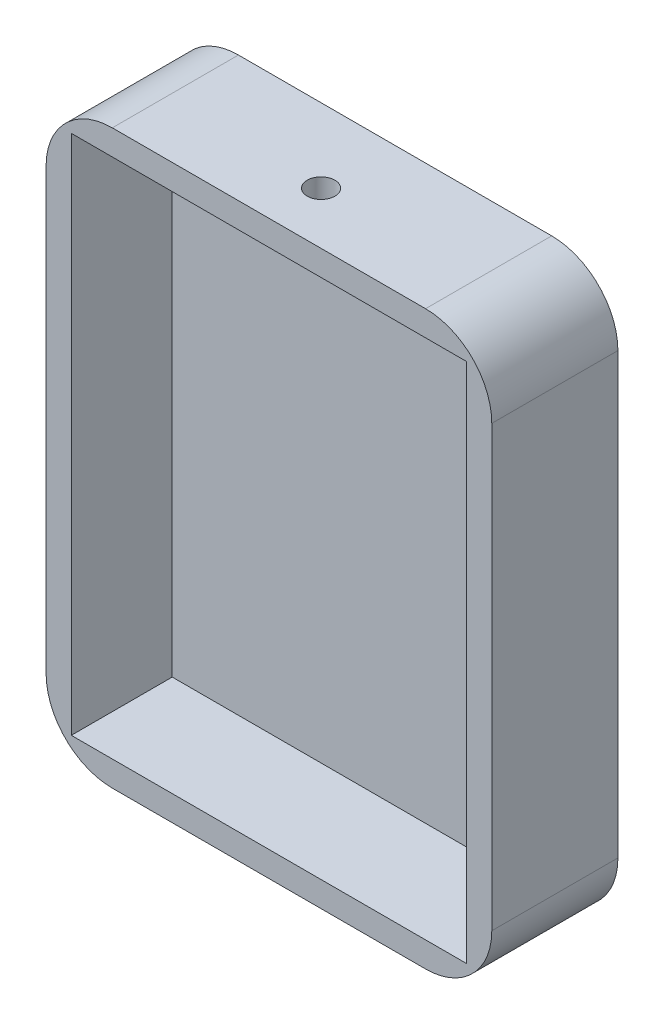
ISO-10303-21;
HEADER;
FILE_DESCRIPTION(('STEP AP214'),'2;1');
FILE_NAME('part.step','',(''),(''),'','','');
FILE_SCHEMA(('AUTOMOTIVE_DESIGN { 1 0 10303 214 1 1 1 1 }'));
ENDSEC;
DATA;
#1=APPLICATION_CONTEXT('core data for automotive mechanical design processes');
#2=APPLICATION_PROTOCOL_DEFINITION('international standard','automotive_design',2000,#1);
#3=PRODUCT_CONTEXT('',#1,'mechanical');
#4=PRODUCT('Part','Part','',(#3));
#5=PRODUCT_RELATED_PRODUCT_CATEGORY('part','',(#4));
#6=PRODUCT_DEFINITION_FORMATION('','',#4);
#7=PRODUCT_DEFINITION_CONTEXT('part definition',#1,'design');
#8=PRODUCT_DEFINITION('design','',#6,#7);
#9=PRODUCT_DEFINITION_SHAPE('','',#8);
#10=(LENGTH_UNIT() NAMED_UNIT(*) SI_UNIT(.MILLI.,.METRE.));
#11=(NAMED_UNIT(*) PLANE_ANGLE_UNIT() SI_UNIT($,.RADIAN.));
#12=(NAMED_UNIT(*) SI_UNIT($,.STERADIAN.) SOLID_ANGLE_UNIT());
#13=UNCERTAINTY_MEASURE_WITH_UNIT(LENGTH_MEASURE(1.E-05),#10,'distance_accuracy_value','');
#14=(GEOMETRIC_REPRESENTATION_CONTEXT(3) GLOBAL_UNCERTAINTY_ASSIGNED_CONTEXT((#13)) GLOBAL_UNIT_ASSIGNED_CONTEXT((#10,
#11,#12)) REPRESENTATION_CONTEXT('',''));
#15=CARTESIAN_POINT('',(0.,0.,0.));
#16=DIRECTION('',(0.,0.,1.));
#17=DIRECTION('',(1.,0.,0.));
#18=AXIS2_PLACEMENT_3D('',#15,#16,#17);
#19=CARTESIAN_POINT('',(0.,0.,19.05));
#20=DIRECTION('',(0.,0.,-1.));
#21=DIRECTION('',(-1.,0.,0.));
#22=AXIS2_PLACEMENT_3D('',#19,#20,#21);
#23=PLANE('',#22);
#24=DIRECTION('',(0.,-1.,0.));
#25=VECTOR('',#24,1.);
#26=CARTESIAN_POINT('',(-33.655,-43.18,19.05));
#27=LINE('',#26,#25);
#28=CARTESIAN_POINT('',(-33.655,33.18,19.05));
#29=VERTEX_POINT('',#28);
#30=CARTESIAN_POINT('',(-33.655,-33.18,19.05));
#31=VERTEX_POINT('',#30);
#32=EDGE_CURVE('E183',#29,#31,#27,.T.);
#33=ORIENTED_EDGE('',*,*,#32,.T.);
#34=CARTESIAN_POINT('',(-23.655,-33.18,19.05));
#35=DIRECTION('',(0.,0.,-1.));
#36=DIRECTION('',(-1.,0.,0.));
#37=AXIS2_PLACEMENT_3D('',#34,#35,#36);
#38=CIRCLE('',#37,10.);
#39=CARTESIAN_POINT('',(-23.655,-43.18,19.05));
#40=VERTEX_POINT('',#39);
#41=EDGE_CURVE('E239',#31,#40,#38,.F.);
#42=ORIENTED_EDGE('',*,*,#41,.T.);
#43=DIRECTION('',(1.,0.,0.));
#44=VECTOR('',#43,1.);
#45=CARTESIAN_POINT('',(-33.655,-43.18,19.05));
#46=LINE('',#45,#44);
#47=CARTESIAN_POINT('',(23.655,-43.18,19.05));
#48=VERTEX_POINT('',#47);
#49=EDGE_CURVE('E187',#40,#48,#46,.T.);
#50=ORIENTED_EDGE('',*,*,#49,.T.);
#51=CARTESIAN_POINT('',(23.655,-33.18,19.05));
#52=DIRECTION('',(0.,0.,-1.));
#53=DIRECTION('',(-1.,0.,0.));
#54=AXIS2_PLACEMENT_3D('',#51,#52,#53);
#55=CIRCLE('',#54,10.);
#56=CARTESIAN_POINT('',(33.655,-33.18,19.05));
#57=VERTEX_POINT('',#56);
#58=EDGE_CURVE('E233',#48,#57,#55,.F.);
#59=ORIENTED_EDGE('',*,*,#58,.T.);
#60=DIRECTION('',(0.,1.,0.));
#61=VECTOR('',#60,1.);
#62=CARTESIAN_POINT('',(33.655,-43.18,19.05));
#63=LINE('',#62,#61);
#64=CARTESIAN_POINT('',(33.655,33.18,19.05));
#65=VERTEX_POINT('',#64);
#66=EDGE_CURVE('E176',#57,#65,#63,.T.);
#67=ORIENTED_EDGE('',*,*,#66,.T.);
#68=CARTESIAN_POINT('',(23.655,33.18,19.05));
#69=DIRECTION('',(0.,0.,-1.));
#70=DIRECTION('',(-1.,0.,0.));
#71=AXIS2_PLACEMENT_3D('',#68,#69,#70);
#72=CIRCLE('',#71,10.);
#73=CARTESIAN_POINT('',(23.655,43.18,19.05));
#74=VERTEX_POINT('',#73);
#75=EDGE_CURVE('E61',#65,#74,#72,.F.);
#76=ORIENTED_EDGE('',*,*,#75,.T.);
#77=DIRECTION('',(-1.,0.,0.));
#78=VECTOR('',#77,1.);
#79=CARTESIAN_POINT('',(-33.655,43.18,19.05));
#80=LINE('',#79,#78);
#81=CARTESIAN_POINT('',(-23.655,43.18,19.05));
#82=VERTEX_POINT('',#81);
#83=EDGE_CURVE('E179',#74,#82,#80,.T.);
#84=ORIENTED_EDGE('',*,*,#83,.T.);
#85=CARTESIAN_POINT('',(-23.655,33.18,19.05));
#86=DIRECTION('',(0.,0.,-1.));
#87=DIRECTION('',(-1.,0.,0.));
#88=AXIS2_PLACEMENT_3D('',#85,#86,#87);
#89=CIRCLE('',#88,10.);
#90=EDGE_CURVE('E236',#82,#29,#89,.F.);
#91=ORIENTED_EDGE('',*,*,#90,.T.);
#92=EDGE_LOOP('',(#33,#42,#50,#59,#67,#76,#84,#91));
#93=FACE_BOUND('',#92,.T.);
#94=DIRECTION('',(0.,1.,0.));
#95=VECTOR('',#94,1.);
#96=CARTESIAN_POINT('',(29.845,0.,19.05));
#97=LINE('',#96,#95);
#98=CARTESIAN_POINT('',(29.845,-39.37,19.05));
#99=VERTEX_POINT('',#98);
#100=CARTESIAN_POINT('',(29.845,39.37,19.05));
#101=VERTEX_POINT('',#100);
#102=EDGE_CURVE('E160',#99,#101,#97,.T.);
#103=ORIENTED_EDGE('',*,*,#102,.F.);
#104=DIRECTION('',(1.,0.,0.));
#105=VECTOR('',#104,1.);
#106=CARTESIAN_POINT('',(0.,-39.37,19.05));
#107=LINE('',#106,#105);
#108=CARTESIAN_POINT('',(-29.845,-39.37,19.05));
#109=VERTEX_POINT('',#108);
#110=EDGE_CURVE('E173',#109,#99,#107,.T.);
#111=ORIENTED_EDGE('',*,*,#110,.F.);
#112=DIRECTION('',(0.,-1.,0.));
#113=VECTOR('',#112,1.);
#114=CARTESIAN_POINT('',(-29.845,0.,19.05));
#115=LINE('',#114,#113);
#116=CARTESIAN_POINT('',(-29.845,39.37,19.05));
#117=VERTEX_POINT('',#116);
#118=EDGE_CURVE('E170',#117,#109,#115,.T.);
#119=ORIENTED_EDGE('',*,*,#118,.F.);
#120=DIRECTION('',(-1.,0.,0.));
#121=VECTOR('',#120,1.);
#122=CARTESIAN_POINT('',(0.,39.37,19.05));
#123=LINE('',#122,#121);
#124=EDGE_CURVE('E146',#101,#117,#123,.T.);
#125=ORIENTED_EDGE('',*,*,#124,.F.);
#126=EDGE_LOOP('',(#103,#111,#119,#125));
#127=FACE_BOUND('',#126,.T.);
#128=ADVANCED_FACE('F38',(#93,#127),#23,.F.);
#129=CARTESIAN_POINT('',(33.655,-43.18,19.05));
#130=DIRECTION('',(-1.,0.,0.));
#131=DIRECTION('',(0.,0.,1.));
#132=AXIS2_PLACEMENT_3D('',#129,#130,#131);
#133=PLANE('',#132);
#134=ORIENTED_EDGE('',*,*,#66,.F.);
#135=DIRECTION('',(0.,0.,-1.));
#136=VECTOR('',#135,1.);
#137=CARTESIAN_POINT('',(33.655,-33.18,19.05));
#138=LINE('',#137,#136);
#139=CARTESIAN_POINT('',(33.655,-33.18,0.));
#140=VERTEX_POINT('',#139);
#141=EDGE_CURVE('E11',#57,#140,#138,.T.);
#142=ORIENTED_EDGE('',*,*,#141,.T.);
#143=DIRECTION('',(0.,1.,0.));
#144=VECTOR('',#143,1.);
#145=CARTESIAN_POINT('',(33.655,-43.18,0.));
#146=LINE('',#145,#144);
#147=CARTESIAN_POINT('',(33.655,33.18,0.));
#148=VERTEX_POINT('',#147);
#149=EDGE_CURVE('E192',#140,#148,#146,.T.);
#150=ORIENTED_EDGE('',*,*,#149,.T.);
#151=DIRECTION('',(0.,0.,-1.));
#152=VECTOR('',#151,1.);
#153=CARTESIAN_POINT('',(33.655,33.18,19.05));
#154=LINE('',#153,#152);
#155=EDGE_CURVE('E47',#148,#65,#154,.F.);
#156=ORIENTED_EDGE('',*,*,#155,.T.);
#157=EDGE_LOOP('',(#134,#142,#150,#156));
#158=FACE_BOUND('',#157,.T.);
#159=ADVANCED_FACE('F251',(#158),#133,.F.);
#160=CARTESIAN_POINT('',(-33.655,43.18,19.05));
#161=DIRECTION('',(0.,-1.,0.));
#162=DIRECTION('',(0.,0.,-1.));
#163=AXIS2_PLACEMENT_3D('',#160,#161,#162);
#164=PLANE('',#163);
#165=CARTESIAN_POINT('',(0.,43.18,11.176));
#166=DIRECTION('',(0.,1.,0.));
#167=DIRECTION('',(0.,0.,1.));
#168=AXIS2_PLACEMENT_3D('',#165,#166,#167);
#169=CIRCLE('',#168,2.0955);
#170=CARTESIAN_POINT('',(0.,43.18,13.2715));
#171=VERTEX_POINT('',#170);
#172=EDGE_CURVE('E338',#171,#171,#169,.T.);
#173=ORIENTED_EDGE('',*,*,#172,.F.);
#174=EDGE_LOOP('',(#173));
#175=FACE_BOUND('',#174,.T.);
#176=DIRECTION('',(-1.,0.,0.));
#177=VECTOR('',#176,1.);
#178=CARTESIAN_POINT('',(-33.655,43.18,0.));
#179=LINE('',#178,#177);
#180=CARTESIAN_POINT('',(23.655,43.18,0.));
#181=VERTEX_POINT('',#180);
#182=CARTESIAN_POINT('',(-23.655,43.18,0.));
#183=VERTEX_POINT('',#182);
#184=EDGE_CURVE('E196',#181,#183,#179,.T.);
#185=ORIENTED_EDGE('',*,*,#184,.T.);
#186=DIRECTION('',(0.,0.,-1.));
#187=VECTOR('',#186,1.);
#188=CARTESIAN_POINT('',(-23.655,43.18,19.05));
#189=LINE('',#188,#187);
#190=EDGE_CURVE('E54',#183,#82,#189,.F.);
#191=ORIENTED_EDGE('',*,*,#190,.T.);
#192=ORIENTED_EDGE('',*,*,#83,.F.);
#193=DIRECTION('',(0.,0.,-1.));
#194=VECTOR('',#193,1.);
#195=CARTESIAN_POINT('',(23.655,43.18,19.05));
#196=LINE('',#195,#194);
#197=EDGE_CURVE('E242',#74,#181,#196,.T.);
#198=ORIENTED_EDGE('',*,*,#197,.T.);
#199=EDGE_LOOP('',(#185,#191,#192,#198));
#200=FACE_BOUND('',#199,.T.);
#201=ADVANCED_FACE('F259',(#175,#200),#164,.F.);
#202=CARTESIAN_POINT('',(-33.655,-43.18,19.05));
#203=DIRECTION('',(1.,0.,0.));
#204=DIRECTION('',(0.,0.,-1.));
#205=AXIS2_PLACEMENT_3D('',#202,#203,#204);
#206=PLANE('',#205);
#207=DIRECTION('',(0.,-1.,0.));
#208=VECTOR('',#207,1.);
#209=CARTESIAN_POINT('',(-33.655,-43.18,0.));
#210=LINE('',#209,#208);
#211=CARTESIAN_POINT('',(-33.655,33.18,0.));
#212=VERTEX_POINT('',#211);
#213=CARTESIAN_POINT('',(-33.655,-33.18,0.));
#214=VERTEX_POINT('',#213);
#215=EDGE_CURVE('E199',#212,#214,#210,.T.);
#216=ORIENTED_EDGE('',*,*,#215,.T.);
#217=DIRECTION('',(0.,0.,-1.));
#218=VECTOR('',#217,1.);
#219=CARTESIAN_POINT('',(-33.655,-33.18,19.05));
#220=LINE('',#219,#218);
#221=EDGE_CURVE('E228',#214,#31,#220,.F.);
#222=ORIENTED_EDGE('',*,*,#221,.T.);
#223=ORIENTED_EDGE('',*,*,#32,.F.);
#224=DIRECTION('',(0.,0.,-1.));
#225=VECTOR('',#224,1.);
#226=CARTESIAN_POINT('',(-33.655,33.18,19.05));
#227=LINE('',#226,#225);
#228=EDGE_CURVE('E224',#29,#212,#227,.T.);
#229=ORIENTED_EDGE('',*,*,#228,.T.);
#230=EDGE_LOOP('',(#216,#222,#223,#229));
#231=FACE_BOUND('',#230,.T.);
#232=ADVANCED_FACE('F270',(#231),#206,.F.);
#233=CARTESIAN_POINT('',(-33.655,-43.18,19.05));
#234=DIRECTION('',(0.,1.,0.));
#235=DIRECTION('',(0.,0.,1.));
#236=AXIS2_PLACEMENT_3D('',#233,#234,#235);
#237=PLANE('',#236);
#238=ORIENTED_EDGE('',*,*,#49,.F.);
#239=DIRECTION('',(0.,0.,-1.));
#240=VECTOR('',#239,1.);
#241=CARTESIAN_POINT('',(-23.655,-43.18,19.05));
#242=LINE('',#241,#240);
#243=CARTESIAN_POINT('',(-23.655,-43.18,0.));
#244=VERTEX_POINT('',#243);
#245=EDGE_CURVE('E208',#40,#244,#242,.T.);
#246=ORIENTED_EDGE('',*,*,#245,.T.);
#247=DIRECTION('',(1.,0.,0.));
#248=VECTOR('',#247,1.);
#249=CARTESIAN_POINT('',(-33.655,-43.18,0.));
#250=LINE('',#249,#248);
#251=CARTESIAN_POINT('',(23.655,-43.18,0.));
#252=VERTEX_POINT('',#251);
#253=EDGE_CURVE('E180',#244,#252,#250,.T.);
#254=ORIENTED_EDGE('',*,*,#253,.T.);
#255=DIRECTION('',(0.,0.,-1.));
#256=VECTOR('',#255,1.);
#257=CARTESIAN_POINT('',(23.655,-43.18,19.05));
#258=LINE('',#257,#256);
#259=EDGE_CURVE('E191',#252,#48,#258,.F.);
#260=ORIENTED_EDGE('',*,*,#259,.T.);
#261=EDGE_LOOP('',(#238,#246,#254,#260));
#262=FACE_BOUND('',#261,.T.);
#263=ADVANCED_FACE('F278',(#262),#237,.F.);
#264=CARTESIAN_POINT('',(0.,0.,0.));
#265=DIRECTION('',(0.,0.,-1.));
#266=DIRECTION('',(-1.,0.,0.));
#267=AXIS2_PLACEMENT_3D('',#264,#265,#266);
#268=PLANE('',#267);
#269=ORIENTED_EDGE('',*,*,#253,.F.);
#270=CARTESIAN_POINT('',(-23.655,-33.18,0.));
#271=DIRECTION('',(0.,0.,-1.));
#272=DIRECTION('',(-1.,0.,0.));
#273=AXIS2_PLACEMENT_3D('',#270,#271,#272);
#274=CIRCLE('',#273,10.);
#275=EDGE_CURVE('E221',#244,#214,#274,.T.);
#276=ORIENTED_EDGE('',*,*,#275,.T.);
#277=ORIENTED_EDGE('',*,*,#215,.F.);
#278=CARTESIAN_POINT('',(-23.655,33.18,0.));
#279=DIRECTION('',(0.,0.,-1.));
#280=DIRECTION('',(-1.,0.,0.));
#281=AXIS2_PLACEMENT_3D('',#278,#279,#280);
#282=CIRCLE('',#281,10.);
#283=EDGE_CURVE('E218',#212,#183,#282,.T.);
#284=ORIENTED_EDGE('',*,*,#283,.T.);
#285=ORIENTED_EDGE('',*,*,#184,.F.);
#286=CARTESIAN_POINT('',(23.655,33.18,0.));
#287=DIRECTION('',(0.,0.,-1.));
#288=DIRECTION('',(-1.,0.,0.));
#289=AXIS2_PLACEMENT_3D('',#286,#287,#288);
#290=CIRCLE('',#289,10.);
#291=EDGE_CURVE('E212',#181,#148,#290,.T.);
#292=ORIENTED_EDGE('',*,*,#291,.T.);
#293=ORIENTED_EDGE('',*,*,#149,.F.);
#294=CARTESIAN_POINT('',(23.655,-33.18,0.));
#295=DIRECTION('',(0.,0.,-1.));
#296=DIRECTION('',(-1.,0.,0.));
#297=AXIS2_PLACEMENT_3D('',#294,#295,#296);
#298=CIRCLE('',#297,10.);
#299=EDGE_CURVE('E215',#140,#252,#298,.T.);
#300=ORIENTED_EDGE('',*,*,#299,.T.);
#301=EDGE_LOOP('',(#269,#276,#277,#284,#285,#292,#293,#300));
#302=FACE_BOUND('',#301,.T.);
#303=ADVANCED_FACE('F262',(#302),#268,.T.);
#304=CARTESIAN_POINT('',(29.845,-43.18,19.05));
#305=DIRECTION('',(-1.,0.,0.));
#306=DIRECTION('',(0.,0.,1.));
#307=AXIS2_PLACEMENT_3D('',#304,#305,#306);
#308=PLANE('',#307);
#309=DIRECTION('',(0.,1.,0.));
#310=VECTOR('',#309,1.);
#311=CARTESIAN_POINT('',(29.845,0.,3.81));
#312=LINE('',#311,#310);
#313=CARTESIAN_POINT('',(29.845,-39.37,3.81));
#314=VERTEX_POINT('',#313);
#315=CARTESIAN_POINT('',(29.845,39.37,3.81));
#316=VERTEX_POINT('',#315);
#317=EDGE_CURVE('E136',#314,#316,#312,.T.);
#318=ORIENTED_EDGE('',*,*,#317,.F.);
#319=DIRECTION('',(0.,0.,-1.));
#320=VECTOR('',#319,1.);
#321=CARTESIAN_POINT('',(29.845,-39.37,19.05));
#322=LINE('',#321,#320);
#323=EDGE_CURVE('E164',#99,#314,#322,.T.);
#324=ORIENTED_EDGE('',*,*,#323,.F.);
#325=ORIENTED_EDGE('',*,*,#102,.T.);
#326=DIRECTION('',(0.,0.,-1.));
#327=VECTOR('',#326,1.);
#328=CARTESIAN_POINT('',(29.845,39.37,19.05));
#329=LINE('',#328,#327);
#330=EDGE_CURVE('E151',#101,#316,#329,.T.);
#331=ORIENTED_EDGE('',*,*,#330,.T.);
#332=EDGE_LOOP('',(#318,#324,#325,#331));
#333=FACE_BOUND('',#332,.T.);
#334=ADVANCED_FACE('F300',(#333),#308,.T.);
#335=CARTESIAN_POINT('',(-33.655,39.37,19.05));
#336=DIRECTION('',(0.,-1.,0.));
#337=DIRECTION('',(0.,0.,-1.));
#338=AXIS2_PLACEMENT_3D('',#335,#336,#337);
#339=PLANE('',#338);
#340=CARTESIAN_POINT('',(0.,39.37,11.176));
#341=DIRECTION('',(0.,-1.,0.));
#342=DIRECTION('',(0.,0.,-1.));
#343=AXIS2_PLACEMENT_3D('',#340,#341,#342);
#344=CIRCLE('',#343,2.0955);
#345=CARTESIAN_POINT('',(0.,39.37,9.0805));
#346=VERTEX_POINT('',#345);
#347=EDGE_CURVE('E335',#346,#346,#344,.F.);
#348=ORIENTED_EDGE('',*,*,#347,.T.);
#349=EDGE_LOOP('',(#348));
#350=FACE_BOUND('',#349,.T.);
#351=DIRECTION('',(-1.,0.,0.));
#352=VECTOR('',#351,1.);
#353=CARTESIAN_POINT('',(0.,39.37,3.81));
#354=LINE('',#353,#352);
#355=CARTESIAN_POINT('',(-29.845,39.37,3.81));
#356=VERTEX_POINT('',#355);
#357=EDGE_CURVE('E129',#316,#356,#354,.T.);
#358=ORIENTED_EDGE('',*,*,#357,.F.);
#359=ORIENTED_EDGE('',*,*,#330,.F.);
#360=ORIENTED_EDGE('',*,*,#124,.T.);
#361=DIRECTION('',(0.,0.,-1.));
#362=VECTOR('',#361,1.);
#363=CARTESIAN_POINT('',(-29.845,39.37,19.05));
#364=LINE('',#363,#362);
#365=EDGE_CURVE('E143',#117,#356,#364,.T.);
#366=ORIENTED_EDGE('',*,*,#365,.T.);
#367=EDGE_LOOP('',(#358,#359,#360,#366));
#368=FACE_BOUND('',#367,.T.);
#369=ADVANCED_FACE('F144',(#350,#368),#339,.T.);
#370=CARTESIAN_POINT('',(-29.845,-43.18,19.05));
#371=DIRECTION('',(1.,0.,0.));
#372=DIRECTION('',(0.,0.,-1.));
#373=AXIS2_PLACEMENT_3D('',#370,#371,#372);
#374=PLANE('',#373);
#375=DIRECTION('',(0.,-1.,0.));
#376=VECTOR('',#375,1.);
#377=CARTESIAN_POINT('',(-29.845,0.,3.81));
#378=LINE('',#377,#376);
#379=CARTESIAN_POINT('',(-29.845,-39.37,3.81));
#380=VERTEX_POINT('',#379);
#381=EDGE_CURVE('E133',#356,#380,#378,.T.);
#382=ORIENTED_EDGE('',*,*,#381,.F.);
#383=ORIENTED_EDGE('',*,*,#365,.F.);
#384=ORIENTED_EDGE('',*,*,#118,.T.);
#385=DIRECTION('',(0.,0.,-1.));
#386=VECTOR('',#385,1.);
#387=CARTESIAN_POINT('',(-29.845,-39.37,19.05));
#388=LINE('',#387,#386);
#389=EDGE_CURVE('E152',#109,#380,#388,.T.);
#390=ORIENTED_EDGE('',*,*,#389,.T.);
#391=EDGE_LOOP('',(#382,#383,#384,#390));
#392=FACE_BOUND('',#391,.T.);
#393=ADVANCED_FACE('F154',(#392),#374,.T.);
#394=CARTESIAN_POINT('',(-33.655,-39.37,19.05));
#395=DIRECTION('',(0.,1.,0.));
#396=DIRECTION('',(0.,0.,1.));
#397=AXIS2_PLACEMENT_3D('',#394,#395,#396);
#398=PLANE('',#397);
#399=DIRECTION('',(1.,0.,0.));
#400=VECTOR('',#399,1.);
#401=CARTESIAN_POINT('',(0.,-39.37,3.81));
#402=LINE('',#401,#400);
#403=EDGE_CURVE('E157',#380,#314,#402,.T.);
#404=ORIENTED_EDGE('',*,*,#403,.F.);
#405=ORIENTED_EDGE('',*,*,#389,.F.);
#406=ORIENTED_EDGE('',*,*,#110,.T.);
#407=ORIENTED_EDGE('',*,*,#323,.T.);
#408=EDGE_LOOP('',(#404,#405,#406,#407));
#409=FACE_BOUND('',#408,.T.);
#410=ADVANCED_FACE('F312',(#409),#398,.T.);
#411=CARTESIAN_POINT('',(0.,0.,3.81));
#412=DIRECTION('',(0.,0.,-1.));
#413=DIRECTION('',(-1.,0.,0.));
#414=AXIS2_PLACEMENT_3D('',#411,#412,#413);
#415=PLANE('',#414);
#416=ORIENTED_EDGE('',*,*,#317,.T.);
#417=ORIENTED_EDGE('',*,*,#357,.T.);
#418=ORIENTED_EDGE('',*,*,#381,.T.);
#419=ORIENTED_EDGE('',*,*,#403,.T.);
#420=EDGE_LOOP('',(#416,#417,#418,#419));
#421=FACE_BOUND('',#420,.T.);
#422=ADVANCED_FACE('F131',(#421),#415,.F.);
#423=CARTESIAN_POINT('',(-23.655,-33.18,19.05));
#424=DIRECTION('',(0.,0.,-1.));
#425=DIRECTION('',(-1.,0.,0.));
#426=AXIS2_PLACEMENT_3D('',#423,#424,#425);
#427=CYLINDRICAL_SURFACE('',#426,10.);
#428=ORIENTED_EDGE('',*,*,#41,.F.);
#429=ORIENTED_EDGE('',*,*,#221,.F.);
#430=ORIENTED_EDGE('',*,*,#275,.F.);
#431=ORIENTED_EDGE('',*,*,#245,.F.);
#432=EDGE_LOOP('',(#428,#429,#430,#431));
#433=FACE_BOUND('',#432,.T.);
#434=ADVANCED_FACE('F276',(#433),#427,.T.);
#435=CARTESIAN_POINT('',(-23.655,33.18,19.05));
#436=DIRECTION('',(0.,0.,-1.));
#437=DIRECTION('',(-1.,0.,0.));
#438=AXIS2_PLACEMENT_3D('',#435,#436,#437);
#439=CYLINDRICAL_SURFACE('',#438,10.);
#440=ORIENTED_EDGE('',*,*,#90,.F.);
#441=ORIENTED_EDGE('',*,*,#190,.F.);
#442=ORIENTED_EDGE('',*,*,#283,.F.);
#443=ORIENTED_EDGE('',*,*,#228,.F.);
#444=EDGE_LOOP('',(#440,#441,#442,#443));
#445=FACE_BOUND('',#444,.T.);
#446=ADVANCED_FACE('F267',(#445),#439,.T.);
#447=CARTESIAN_POINT('',(23.655,-33.18,19.05));
#448=DIRECTION('',(0.,0.,-1.));
#449=DIRECTION('',(-1.,0.,0.));
#450=AXIS2_PLACEMENT_3D('',#447,#448,#449);
#451=CYLINDRICAL_SURFACE('',#450,10.);
#452=ORIENTED_EDGE('',*,*,#58,.F.);
#453=ORIENTED_EDGE('',*,*,#259,.F.);
#454=ORIENTED_EDGE('',*,*,#299,.F.);
#455=ORIENTED_EDGE('',*,*,#141,.F.);
#456=EDGE_LOOP('',(#452,#453,#454,#455));
#457=FACE_BOUND('',#456,.T.);
#458=ADVANCED_FACE('F281',(#457),#451,.T.);
#459=CARTESIAN_POINT('',(23.655,33.18,19.05));
#460=DIRECTION('',(0.,0.,-1.));
#461=DIRECTION('',(-1.,0.,0.));
#462=AXIS2_PLACEMENT_3D('',#459,#460,#461);
#463=CYLINDRICAL_SURFACE('',#462,10.);
#464=ORIENTED_EDGE('',*,*,#75,.F.);
#465=ORIENTED_EDGE('',*,*,#155,.F.);
#466=ORIENTED_EDGE('',*,*,#291,.F.);
#467=ORIENTED_EDGE('',*,*,#197,.F.);
#468=EDGE_LOOP('',(#464,#465,#466,#467));
#469=FACE_BOUND('',#468,.T.);
#470=ADVANCED_FACE('F40',(#469),#463,.T.);
#471=CARTESIAN_POINT('',(0.,-43.181,11.176));
#472=DIRECTION('',(0.,1.,0.));
#473=DIRECTION('',(0.,0.,1.));
#474=AXIS2_PLACEMENT_3D('',#471,#472,#473);
#475=CYLINDRICAL_SURFACE('',#474,2.0955);
#476=ORIENTED_EDGE('',*,*,#347,.F.);
#477=EDGE_LOOP('',(#476));
#478=FACE_BOUND('',#477,.T.);
#479=ORIENTED_EDGE('',*,*,#172,.T.);
#480=EDGE_LOOP('',(#479));
#481=FACE_BOUND('',#480,.T.);
#482=ADVANCED_FACE('F287',(#478,#481),#475,.F.);
#483=CLOSED_SHELL('',(#128,#159,#201,#232,#263,#303,#334,#369,#393,#410,#422,#434,#446,#458,
#470,#482));
#484=MANIFOLD_SOLID_BREP('B2',#483);
#485=ADVANCED_BREP_SHAPE_REPRESENTATION('',(#18,#484),#14);
#486=SHAPE_DEFINITION_REPRESENTATION(#9,#485);
ENDSEC;
END-ISO-10303-21;
